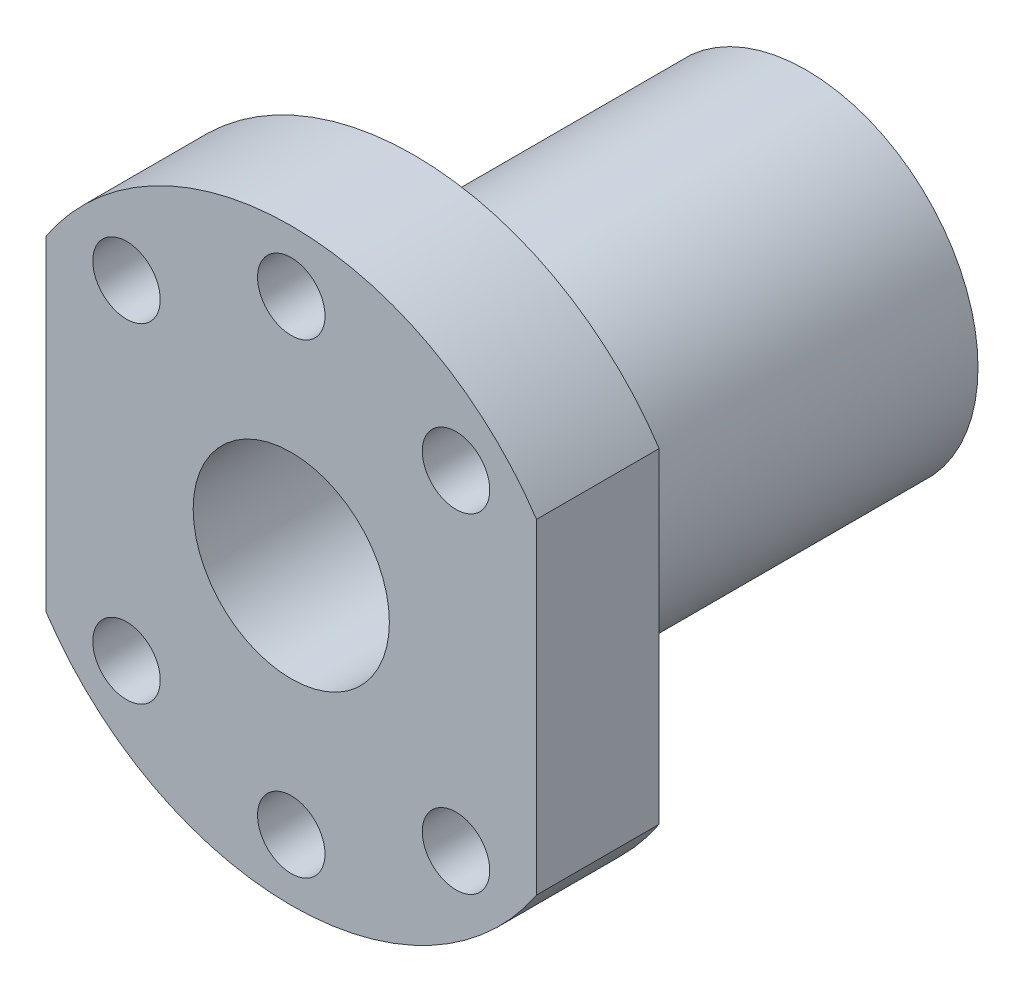
ISO-10303-21;
HEADER;
FILE_DESCRIPTION(('STEP AP214'),'2;1');
FILE_NAME('part.step','',(''),(''),'','','');
FILE_SCHEMA(('AUTOMOTIVE_DESIGN { 1 0 10303 214 1 1 1 1 }'));
ENDSEC;
DATA;
#1=APPLICATION_CONTEXT('core data for automotive mechanical design processes');
#2=APPLICATION_PROTOCOL_DEFINITION('international standard','automotive_design',2000,#1);
#3=PRODUCT_CONTEXT('',#1,'mechanical');
#4=PRODUCT('Part','Part','',(#3));
#5=PRODUCT_RELATED_PRODUCT_CATEGORY('part','',(#4));
#6=PRODUCT_DEFINITION_FORMATION('','',#4);
#7=PRODUCT_DEFINITION_CONTEXT('part definition',#1,'design');
#8=PRODUCT_DEFINITION('design','',#6,#7);
#9=PRODUCT_DEFINITION_SHAPE('','',#8);
#10=(LENGTH_UNIT() NAMED_UNIT(*) SI_UNIT(.MILLI.,.METRE.));
#11=(NAMED_UNIT(*) PLANE_ANGLE_UNIT() SI_UNIT($,.RADIAN.));
#12=(NAMED_UNIT(*) SI_UNIT($,.STERADIAN.) SOLID_ANGLE_UNIT());
#13=UNCERTAINTY_MEASURE_WITH_UNIT(LENGTH_MEASURE(1.E-05),#10,'distance_accuracy_value','');
#14=(GEOMETRIC_REPRESENTATION_CONTEXT(3) GLOBAL_UNCERTAINTY_ASSIGNED_CONTEXT((#13)) GLOBAL_UNIT_ASSIGNED_CONTEXT((#10,
#11,#12)) REPRESENTATION_CONTEXT('',''));
#15=CARTESIAN_POINT('',(0.,0.,0.));
#16=DIRECTION('',(0.,0.,1.));
#17=DIRECTION('',(1.,0.,0.));
#18=AXIS2_PLACEMENT_3D('',#15,#16,#17);
#19=CARTESIAN_POINT('',(0.,0.,0.));
#20=DIRECTION('',(0.,0.,1.));
#21=DIRECTION('',(1.,0.,0.));
#22=AXIS2_PLACEMENT_3D('',#19,#20,#21);
#23=PLANE('',#22);
#24=CARTESIAN_POINT('',(0.,0.,0.));
#25=DIRECTION('',(0.,0.,1.));
#26=DIRECTION('',(1.,0.,0.));
#27=AXIS2_PLACEMENT_3D('',#24,#25,#26);
#28=CIRCLE('',#27,14.);
#29=CARTESIAN_POINT('',(14.,0.,0.));
#30=VERTEX_POINT('',#29);
#31=EDGE_CURVE('E45',#30,#30,#28,.T.);
#32=ORIENTED_EDGE('',*,*,#31,.F.);
#33=EDGE_LOOP('',(#32));
#34=FACE_BOUND('',#33,.T.);
#35=CARTESIAN_POINT('',(0.,0.,0.));
#36=DIRECTION('',(0.,0.,1.));
#37=DIRECTION('',(1.,0.,0.));
#38=AXIS2_PLACEMENT_3D('',#35,#36,#37);
#39=CIRCLE('',#38,8.);
#40=CARTESIAN_POINT('',(8.,0.,0.));
#41=VERTEX_POINT('',#40);
#42=EDGE_CURVE('E132',#41,#41,#39,.T.);
#43=ORIENTED_EDGE('',*,*,#42,.T.);
#44=EDGE_LOOP('',(#43));
#45=FACE_BOUND('',#44,.T.);
#46=ADVANCED_FACE('F41',(#34,#45),#23,.F.);
#47=CARTESIAN_POINT('',(0.,0.,32.));
#48=DIRECTION('',(0.,0.,-1.));
#49=DIRECTION('',(-1.,0.,0.));
#50=AXIS2_PLACEMENT_3D('',#47,#48,#49);
#51=CYLINDRICAL_SURFACE('',#50,14.);
#52=CARTESIAN_POINT('',(0.,0.,32.));
#53=DIRECTION('',(0.,0.,1.));
#54=DIRECTION('',(1.,0.,0.));
#55=AXIS2_PLACEMENT_3D('',#52,#53,#54);
#56=CIRCLE('',#55,14.);
#57=CARTESIAN_POINT('',(14.,0.,32.));
#58=VERTEX_POINT('',#57);
#59=EDGE_CURVE('E11',#58,#58,#56,.T.);
#60=ORIENTED_EDGE('',*,*,#59,.F.);
#61=EDGE_LOOP('',(#60));
#62=FACE_BOUND('',#61,.T.);
#63=ORIENTED_EDGE('',*,*,#31,.T.);
#64=EDGE_LOOP('',(#63));
#65=FACE_BOUND('',#64,.T.);
#66=ADVANCED_FACE('F43',(#62,#65),#51,.T.);
#67=CARTESIAN_POINT('',(0.,0.,32.));
#68=DIRECTION('',(0.,0.,-1.));
#69=DIRECTION('',(-1.,0.,0.));
#70=AXIS2_PLACEMENT_3D('',#67,#68,#69);
#71=CYLINDRICAL_SURFACE('',#70,8.);
#72=ORIENTED_EDGE('',*,*,#42,.F.);
#73=EDGE_LOOP('',(#72));
#74=FACE_BOUND('',#73,.T.);
#75=CARTESIAN_POINT('',(0.,0.,42.));
#76=DIRECTION('',(0.,0.,1.));
#77=DIRECTION('',(1.,0.,0.));
#78=AXIS2_PLACEMENT_3D('',#75,#76,#77);
#79=CIRCLE('',#78,8.);
#80=CARTESIAN_POINT('',(8.,0.,42.));
#81=VERTEX_POINT('',#80);
#82=EDGE_CURVE('E119',#81,#81,#79,.T.);
#83=ORIENTED_EDGE('',*,*,#82,.T.);
#84=EDGE_LOOP('',(#83));
#85=FACE_BOUND('',#84,.T.);
#86=ADVANCED_FACE('F146',(#74,#85),#71,.F.);
#87=CARTESIAN_POINT('',(0.,0.,42.));
#88=DIRECTION('',(0.,0.,-1.));
#89=DIRECTION('',(-1.,0.,0.));
#90=AXIS2_PLACEMENT_3D('',#87,#88,#89);
#91=PLANE('',#90);
#92=CARTESIAN_POINT('',(0.,0.,42.));
#93=DIRECTION('',(0.,0.,1.));
#94=DIRECTION('',(-1.,0.,0.));
#95=AXIS2_PLACEMENT_3D('',#92,#93,#94);
#96=CIRCLE('',#95,24.);
#97=CARTESIAN_POINT('',(20.,13.2664991614216,42.));
#98=VERTEX_POINT('',#97);
#99=CARTESIAN_POINT('',(-20.,13.2664991614216,42.));
#100=VERTEX_POINT('',#99);
#101=EDGE_CURVE('E96',#98,#100,#96,.T.);
#102=ORIENTED_EDGE('',*,*,#101,.T.);
#103=DIRECTION('',(0.,-1.,0.));
#104=VECTOR('',#103,1.);
#105=CARTESIAN_POINT('',(-20.,13.2664991614216,42.));
#106=LINE('',#105,#104);
#107=CARTESIAN_POINT('',(-20.,-13.2664991614216,42.));
#108=VERTEX_POINT('',#107);
#109=EDGE_CURVE('E90',#100,#108,#106,.T.);
#110=ORIENTED_EDGE('',*,*,#109,.T.);
#111=CARTESIAN_POINT('',(0.,0.,42.));
#112=DIRECTION('',(0.,0.,1.));
#113=DIRECTION('',(1.,0.,0.));
#114=AXIS2_PLACEMENT_3D('',#111,#112,#113);
#115=CIRCLE('',#114,24.);
#116=CARTESIAN_POINT('',(20.,-13.2664991614216,42.));
#117=VERTEX_POINT('',#116);
#118=EDGE_CURVE('E94',#108,#117,#115,.T.);
#119=ORIENTED_EDGE('',*,*,#118,.T.);
#120=DIRECTION('',(0.,1.,0.));
#121=VECTOR('',#120,1.);
#122=CARTESIAN_POINT('',(20.,13.2664991614216,42.));
#123=LINE('',#122,#121);
#124=EDGE_CURVE('E59',#117,#98,#123,.T.);
#125=ORIENTED_EDGE('',*,*,#124,.T.);
#126=EDGE_LOOP('',(#102,#110,#119,#125));
#127=FACE_BOUND('',#126,.T.);
#128=ORIENTED_EDGE('',*,*,#82,.F.);
#129=EDGE_LOOP('',(#128));
#130=FACE_BOUND('',#129,.T.);
#131=CARTESIAN_POINT('',(0.,19.,42.));
#132=DIRECTION('',(0.,0.,1.));
#133=DIRECTION('',(1.,0.,0.));
#134=AXIS2_PLACEMENT_3D('',#131,#132,#133);
#135=CIRCLE('',#134,2.75);
#136=CARTESIAN_POINT('',(2.75,19.,42.));
#137=VERTEX_POINT('',#136);
#138=EDGE_CURVE('E240',#137,#137,#135,.T.);
#139=ORIENTED_EDGE('',*,*,#138,.F.);
#140=EDGE_LOOP('',(#139));
#141=FACE_BOUND('',#140,.T.);
#142=CARTESIAN_POINT('',(-13.4350288425444,13.4350288425444,42.));
#143=DIRECTION('',(0.,0.,1.));
#144=DIRECTION('',(1.,0.,0.));
#145=AXIS2_PLACEMENT_3D('',#142,#143,#144);
#146=CIRCLE('',#145,2.75);
#147=CARTESIAN_POINT('',(-10.6850288425444,13.4350288425444,42.));
#148=VERTEX_POINT('',#147);
#149=EDGE_CURVE('E232',#148,#148,#146,.T.);
#150=ORIENTED_EDGE('',*,*,#149,.F.);
#151=EDGE_LOOP('',(#150));
#152=FACE_BOUND('',#151,.T.);
#153=CARTESIAN_POINT('',(13.4350288425444,13.4350288425444,42.));
#154=DIRECTION('',(0.,0.,1.));
#155=DIRECTION('',(1.,0.,0.));
#156=AXIS2_PLACEMENT_3D('',#153,#154,#155);
#157=CIRCLE('',#156,2.75);
#158=CARTESIAN_POINT('',(16.1850288425444,13.4350288425444,42.));
#159=VERTEX_POINT('',#158);
#160=EDGE_CURVE('E224',#159,#159,#157,.T.);
#161=ORIENTED_EDGE('',*,*,#160,.F.);
#162=EDGE_LOOP('',(#161));
#163=FACE_BOUND('',#162,.T.);
#164=CARTESIAN_POINT('',(0.,-19.,42.));
#165=DIRECTION('',(0.,0.,1.));
#166=DIRECTION('',(1.,0.,0.));
#167=AXIS2_PLACEMENT_3D('',#164,#165,#166);
#168=CIRCLE('',#167,2.75);
#169=CARTESIAN_POINT('',(2.75,-19.,42.));
#170=VERTEX_POINT('',#169);
#171=EDGE_CURVE('E216',#170,#170,#168,.T.);
#172=ORIENTED_EDGE('',*,*,#171,.F.);
#173=EDGE_LOOP('',(#172));
#174=FACE_BOUND('',#173,.T.);
#175=CARTESIAN_POINT('',(13.4350288425444,-13.4350288425444,42.));
#176=DIRECTION('',(0.,0.,1.));
#177=DIRECTION('',(1.,0.,0.));
#178=AXIS2_PLACEMENT_3D('',#175,#176,#177);
#179=CIRCLE('',#178,2.75);
#180=CARTESIAN_POINT('',(16.1850288425444,-13.4350288425444,42.));
#181=VERTEX_POINT('',#180);
#182=EDGE_CURVE('E208',#181,#181,#179,.T.);
#183=ORIENTED_EDGE('',*,*,#182,.F.);
#184=EDGE_LOOP('',(#183));
#185=FACE_BOUND('',#184,.T.);
#186=CARTESIAN_POINT('',(-13.4350288425444,-13.4350288425444,42.));
#187=DIRECTION('',(0.,0.,1.));
#188=DIRECTION('',(1.,0.,0.));
#189=AXIS2_PLACEMENT_3D('',#186,#187,#188);
#190=CIRCLE('',#189,2.75);
#191=CARTESIAN_POINT('',(-10.6850288425444,-13.4350288425444,42.));
#192=VERTEX_POINT('',#191);
#193=EDGE_CURVE('E197',#192,#192,#190,.T.);
#194=ORIENTED_EDGE('',*,*,#193,.F.);
#195=EDGE_LOOP('',(#194));
#196=FACE_BOUND('',#195,.T.);
#197=ADVANCED_FACE('F91',(#127,#130,#141,#152,#163,#174,#185,#196),#91,.F.);
#198=CARTESIAN_POINT('',(0.,0.,32.));
#199=DIRECTION('',(0.,0.,-1.));
#200=DIRECTION('',(-1.,0.,0.));
#201=AXIS2_PLACEMENT_3D('',#198,#199,#200);
#202=PLANE('',#201);
#203=ORIENTED_EDGE('',*,*,#59,.T.);
#204=EDGE_LOOP('',(#203));
#205=FACE_BOUND('',#204,.T.);
#206=CARTESIAN_POINT('',(13.4350288425444,-13.4350288425444,32.));
#207=DIRECTION('',(0.,0.,1.));
#208=DIRECTION('',(1.,0.,0.));
#209=AXIS2_PLACEMENT_3D('',#206,#207,#208);
#210=CIRCLE('',#209,2.75);
#211=CARTESIAN_POINT('',(16.1850288425444,-13.4350288425444,32.));
#212=VERTEX_POINT('',#211);
#213=EDGE_CURVE('E205',#212,#212,#210,.T.);
#214=ORIENTED_EDGE('',*,*,#213,.T.);
#215=EDGE_LOOP('',(#214));
#216=FACE_BOUND('',#215,.T.);
#217=CARTESIAN_POINT('',(13.4350288425444,13.4350288425444,32.));
#218=DIRECTION('',(0.,0.,1.));
#219=DIRECTION('',(1.,0.,0.));
#220=AXIS2_PLACEMENT_3D('',#217,#218,#219);
#221=CIRCLE('',#220,2.75);
#222=CARTESIAN_POINT('',(16.1850288425444,13.4350288425444,32.));
#223=VERTEX_POINT('',#222);
#224=EDGE_CURVE('E220',#223,#223,#221,.T.);
#225=ORIENTED_EDGE('',*,*,#224,.T.);
#226=EDGE_LOOP('',(#225));
#227=FACE_BOUND('',#226,.T.);
#228=CARTESIAN_POINT('',(0.,19.,32.));
#229=DIRECTION('',(0.,0.,1.));
#230=DIRECTION('',(1.,0.,0.));
#231=AXIS2_PLACEMENT_3D('',#228,#229,#230);
#232=CIRCLE('',#231,2.75);
#233=CARTESIAN_POINT('',(2.75,19.,32.));
#234=VERTEX_POINT('',#233);
#235=EDGE_CURVE('E236',#234,#234,#232,.T.);
#236=ORIENTED_EDGE('',*,*,#235,.T.);
#237=EDGE_LOOP('',(#236));
#238=FACE_BOUND('',#237,.T.);
#239=CARTESIAN_POINT('',(0.,0.,32.));
#240=DIRECTION('',(0.,0.,1.));
#241=DIRECTION('',(-1.,0.,0.));
#242=AXIS2_PLACEMENT_3D('',#239,#240,#241);
#243=CIRCLE('',#242,24.);
#244=CARTESIAN_POINT('',(20.,13.2664991614216,32.));
#245=VERTEX_POINT('',#244);
#246=CARTESIAN_POINT('',(-20.,13.2664991614216,32.));
#247=VERTEX_POINT('',#246);
#248=EDGE_CURVE('E115',#245,#247,#243,.T.);
#249=ORIENTED_EDGE('',*,*,#248,.F.);
#250=DIRECTION('',(0.,1.,0.));
#251=VECTOR('',#250,1.);
#252=CARTESIAN_POINT('',(20.,13.2664991614216,32.));
#253=LINE('',#252,#251);
#254=CARTESIAN_POINT('',(20.,-13.2664991614216,32.));
#255=VERTEX_POINT('',#254);
#256=EDGE_CURVE('E82',#255,#245,#253,.T.);
#257=ORIENTED_EDGE('',*,*,#256,.F.);
#258=CARTESIAN_POINT('',(0.,0.,32.));
#259=DIRECTION('',(0.,0.,1.));
#260=DIRECTION('',(1.,0.,0.));
#261=AXIS2_PLACEMENT_3D('',#258,#259,#260);
#262=CIRCLE('',#261,24.);
#263=CARTESIAN_POINT('',(-20.,-13.2664991614216,32.));
#264=VERTEX_POINT('',#263);
#265=EDGE_CURVE('E76',#264,#255,#262,.T.);
#266=ORIENTED_EDGE('',*,*,#265,.F.);
#267=DIRECTION('',(0.,-1.,0.));
#268=VECTOR('',#267,1.);
#269=CARTESIAN_POINT('',(-20.,13.2664991614216,32.));
#270=LINE('',#269,#268);
#271=EDGE_CURVE('E102',#247,#264,#270,.T.);
#272=ORIENTED_EDGE('',*,*,#271,.F.);
#273=EDGE_LOOP('',(#249,#257,#266,#272));
#274=FACE_BOUND('',#273,.T.);
#275=CARTESIAN_POINT('',(-13.4350288425444,13.4350288425444,32.));
#276=DIRECTION('',(0.,0.,1.));
#277=DIRECTION('',(1.,0.,0.));
#278=AXIS2_PLACEMENT_3D('',#275,#276,#277);
#279=CIRCLE('',#278,2.75);
#280=CARTESIAN_POINT('',(-10.6850288425444,13.4350288425444,32.));
#281=VERTEX_POINT('',#280);
#282=EDGE_CURVE('E228',#281,#281,#279,.T.);
#283=ORIENTED_EDGE('',*,*,#282,.T.);
#284=EDGE_LOOP('',(#283));
#285=FACE_BOUND('',#284,.T.);
#286=CARTESIAN_POINT('',(0.,-19.,32.));
#287=DIRECTION('',(0.,0.,1.));
#288=DIRECTION('',(1.,0.,0.));
#289=AXIS2_PLACEMENT_3D('',#286,#287,#288);
#290=CIRCLE('',#289,2.75);
#291=CARTESIAN_POINT('',(2.75,-19.,32.));
#292=VERTEX_POINT('',#291);
#293=EDGE_CURVE('E212',#292,#292,#290,.T.);
#294=ORIENTED_EDGE('',*,*,#293,.T.);
#295=EDGE_LOOP('',(#294));
#296=FACE_BOUND('',#295,.T.);
#297=CARTESIAN_POINT('',(-13.4350288425444,-13.4350288425444,32.));
#298=DIRECTION('',(0.,0.,1.));
#299=DIRECTION('',(1.,0.,0.));
#300=AXIS2_PLACEMENT_3D('',#297,#298,#299);
#301=CIRCLE('',#300,2.75);
#302=CARTESIAN_POINT('',(-10.6850288425444,-13.4350288425444,32.));
#303=VERTEX_POINT('',#302);
#304=EDGE_CURVE('E200',#303,#303,#301,.T.);
#305=ORIENTED_EDGE('',*,*,#304,.T.);
#306=EDGE_LOOP('',(#305));
#307=FACE_BOUND('',#306,.T.);
#308=ADVANCED_FACE('F155',(#205,#216,#227,#238,#274,#285,#296,#307),#202,.T.);
#309=CARTESIAN_POINT('',(0.,0.,42.));
#310=DIRECTION('',(0.,0.,-1.));
#311=DIRECTION('',(-1.,0.,0.));
#312=AXIS2_PLACEMENT_3D('',#309,#310,#311);
#313=CYLINDRICAL_SURFACE('',#312,24.);
#314=ORIENTED_EDGE('',*,*,#248,.T.);
#315=DIRECTION('',(0.,0.,-1.));
#316=VECTOR('',#315,1.);
#317=CARTESIAN_POINT('',(-20.,13.2664991614216,42.));
#318=LINE('',#317,#316);
#319=EDGE_CURVE('E104',#100,#247,#318,.T.);
#320=ORIENTED_EDGE('',*,*,#319,.F.);
#321=ORIENTED_EDGE('',*,*,#101,.F.);
#322=DIRECTION('',(0.,0.,-1.));
#323=VECTOR('',#322,1.);
#324=CARTESIAN_POINT('',(20.,13.2664991614216,42.));
#325=LINE('',#324,#323);
#326=EDGE_CURVE('E111',#98,#245,#325,.T.);
#327=ORIENTED_EDGE('',*,*,#326,.T.);
#328=EDGE_LOOP('',(#314,#320,#321,#327));
#329=FACE_BOUND('',#328,.T.);
#330=ADVANCED_FACE('F152',(#329),#313,.T.);
#331=CARTESIAN_POINT('',(-20.,13.2664991614216,42.));
#332=DIRECTION('',(1.,0.,0.));
#333=DIRECTION('',(0.,0.,-1.));
#334=AXIS2_PLACEMENT_3D('',#331,#332,#333);
#335=PLANE('',#334);
#336=ORIENTED_EDGE('',*,*,#271,.T.);
#337=DIRECTION('',(0.,0.,-1.));
#338=VECTOR('',#337,1.);
#339=CARTESIAN_POINT('',(-20.,-13.2664991614216,42.));
#340=LINE('',#339,#338);
#341=EDGE_CURVE('E100',#108,#264,#340,.T.);
#342=ORIENTED_EDGE('',*,*,#341,.F.);
#343=ORIENTED_EDGE('',*,*,#109,.F.);
#344=ORIENTED_EDGE('',*,*,#319,.T.);
#345=EDGE_LOOP('',(#336,#342,#343,#344));
#346=FACE_BOUND('',#345,.T.);
#347=ADVANCED_FACE('F101',(#346),#335,.F.);
#348=CARTESIAN_POINT('',(0.,0.,42.));
#349=DIRECTION('',(0.,0.,-1.));
#350=DIRECTION('',(-1.,0.,0.));
#351=AXIS2_PLACEMENT_3D('',#348,#349,#350);
#352=CYLINDRICAL_SURFACE('',#351,24.);
#353=ORIENTED_EDGE('',*,*,#265,.T.);
#354=DIRECTION('',(0.,0.,-1.));
#355=VECTOR('',#354,1.);
#356=CARTESIAN_POINT('',(20.,-13.2664991614216,42.));
#357=LINE('',#356,#355);
#358=EDGE_CURVE('E105',#117,#255,#357,.T.);
#359=ORIENTED_EDGE('',*,*,#358,.F.);
#360=ORIENTED_EDGE('',*,*,#118,.F.);
#361=ORIENTED_EDGE('',*,*,#341,.T.);
#362=EDGE_LOOP('',(#353,#359,#360,#361));
#363=FACE_BOUND('',#362,.T.);
#364=ADVANCED_FACE('F107',(#363),#352,.T.);
#365=CARTESIAN_POINT('',(20.,13.2664991614216,42.));
#366=DIRECTION('',(-1.,0.,0.));
#367=DIRECTION('',(0.,0.,1.));
#368=AXIS2_PLACEMENT_3D('',#365,#366,#367);
#369=PLANE('',#368);
#370=ORIENTED_EDGE('',*,*,#256,.T.);
#371=ORIENTED_EDGE('',*,*,#326,.F.);
#372=ORIENTED_EDGE('',*,*,#124,.F.);
#373=ORIENTED_EDGE('',*,*,#358,.T.);
#374=EDGE_LOOP('',(#370,#371,#372,#373));
#375=FACE_BOUND('',#374,.T.);
#376=ADVANCED_FACE('F161',(#375),#369,.F.);
#377=CARTESIAN_POINT('',(0.,19.,42.));
#378=DIRECTION('',(0.,0.,-1.));
#379=DIRECTION('',(-1.,0.,0.));
#380=AXIS2_PLACEMENT_3D('',#377,#378,#379);
#381=CYLINDRICAL_SURFACE('',#380,2.75);
#382=ORIENTED_EDGE('',*,*,#138,.T.);
#383=EDGE_LOOP('',(#382));
#384=FACE_BOUND('',#383,.T.);
#385=ORIENTED_EDGE('',*,*,#235,.F.);
#386=EDGE_LOOP('',(#385));
#387=FACE_BOUND('',#386,.T.);
#388=ADVANCED_FACE('F164',(#384,#387),#381,.F.);
#389=CARTESIAN_POINT('',(-13.4350288425444,13.4350288425444,42.));
#390=DIRECTION('',(0.,0.,-1.));
#391=DIRECTION('',(-1.,0.,0.));
#392=AXIS2_PLACEMENT_3D('',#389,#390,#391);
#393=CYLINDRICAL_SURFACE('',#392,2.75);
#394=ORIENTED_EDGE('',*,*,#149,.T.);
#395=EDGE_LOOP('',(#394));
#396=FACE_BOUND('',#395,.T.);
#397=ORIENTED_EDGE('',*,*,#282,.F.);
#398=EDGE_LOOP('',(#397));
#399=FACE_BOUND('',#398,.T.);
#400=ADVANCED_FACE('F172',(#396,#399),#393,.F.);
#401=CARTESIAN_POINT('',(13.4350288425444,13.4350288425444,42.));
#402=DIRECTION('',(0.,0.,-1.));
#403=DIRECTION('',(-1.,0.,0.));
#404=AXIS2_PLACEMENT_3D('',#401,#402,#403);
#405=CYLINDRICAL_SURFACE('',#404,2.75);
#406=ORIENTED_EDGE('',*,*,#160,.T.);
#407=EDGE_LOOP('',(#406));
#408=FACE_BOUND('',#407,.T.);
#409=ORIENTED_EDGE('',*,*,#224,.F.);
#410=EDGE_LOOP('',(#409));
#411=FACE_BOUND('',#410,.T.);
#412=ADVANCED_FACE('F176',(#408,#411),#405,.F.);
#413=CARTESIAN_POINT('',(0.,-19.,42.));
#414=DIRECTION('',(0.,0.,-1.));
#415=DIRECTION('',(-1.,0.,0.));
#416=AXIS2_PLACEMENT_3D('',#413,#414,#415);
#417=CYLINDRICAL_SURFACE('',#416,2.75);
#418=ORIENTED_EDGE('',*,*,#171,.T.);
#419=EDGE_LOOP('',(#418));
#420=FACE_BOUND('',#419,.T.);
#421=ORIENTED_EDGE('',*,*,#293,.F.);
#422=EDGE_LOOP('',(#421));
#423=FACE_BOUND('',#422,.T.);
#424=ADVANCED_FACE('F180',(#420,#423),#417,.F.);
#425=CARTESIAN_POINT('',(13.4350288425444,-13.4350288425444,42.));
#426=DIRECTION('',(0.,0.,-1.));
#427=DIRECTION('',(-1.,0.,0.));
#428=AXIS2_PLACEMENT_3D('',#425,#426,#427);
#429=CYLINDRICAL_SURFACE('',#428,2.75);
#430=ORIENTED_EDGE('',*,*,#182,.T.);
#431=EDGE_LOOP('',(#430));
#432=FACE_BOUND('',#431,.T.);
#433=ORIENTED_EDGE('',*,*,#213,.F.);
#434=EDGE_LOOP('',(#433));
#435=FACE_BOUND('',#434,.T.);
#436=ADVANCED_FACE('F184',(#432,#435),#429,.F.);
#437=CARTESIAN_POINT('',(-13.4350288425444,-13.4350288425444,42.));
#438=DIRECTION('',(0.,0.,-1.));
#439=DIRECTION('',(-1.,0.,0.));
#440=AXIS2_PLACEMENT_3D('',#437,#438,#439);
#441=CYLINDRICAL_SURFACE('',#440,2.75);
#442=ORIENTED_EDGE('',*,*,#193,.T.);
#443=EDGE_LOOP('',(#442));
#444=FACE_BOUND('',#443,.T.);
#445=ORIENTED_EDGE('',*,*,#304,.F.);
#446=EDGE_LOOP('',(#445));
#447=FACE_BOUND('',#446,.T.);
#448=ADVANCED_FACE('F188',(#444,#447),#441,.F.);
#449=CLOSED_SHELL('',(#46,#66,#86,#197,#308,#330,#347,#364,#376,#388,#400,#412,#424,#436,#448));
#450=MANIFOLD_SOLID_BREP('B2',#449);
#451=ADVANCED_BREP_SHAPE_REPRESENTATION('',(#18,#450),#14);
#452=SHAPE_DEFINITION_REPRESENTATION(#9,#451);
ENDSEC;
END-ISO-10303-21;
